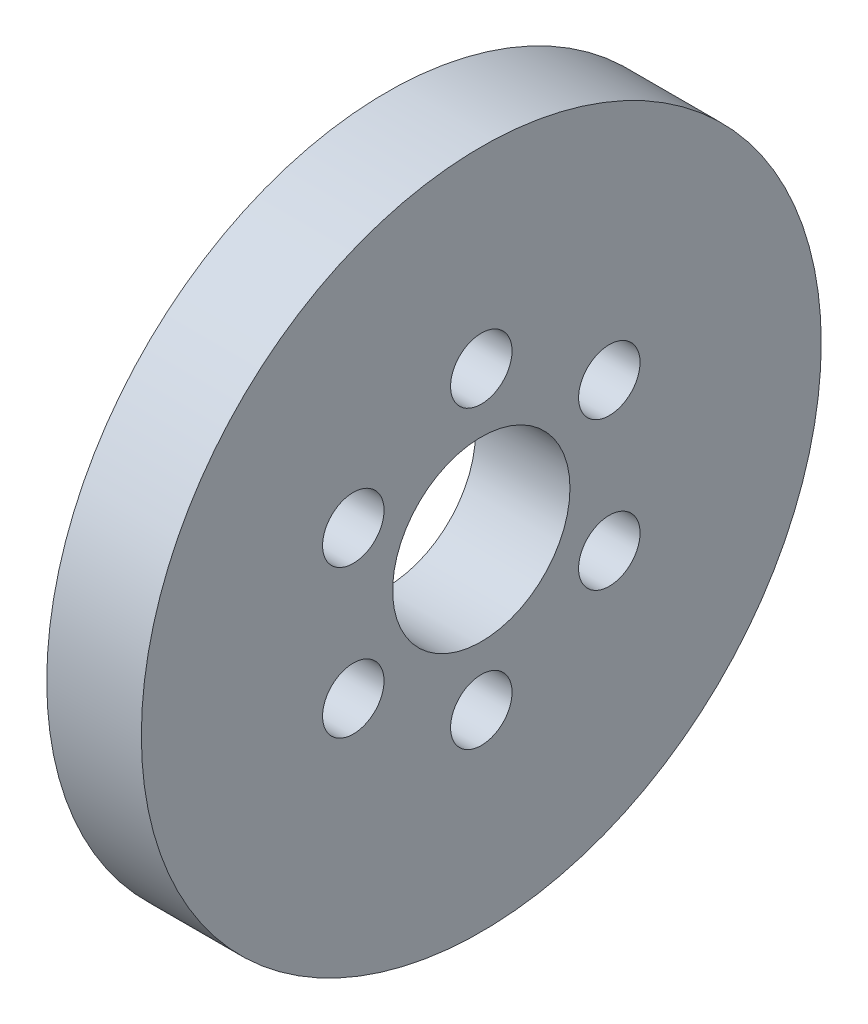
ISO-10303-21;
HEADER;
FILE_DESCRIPTION(('STEP AP214'),'2;1');
FILE_NAME('part.step','',(''),(''),'','','');
FILE_SCHEMA(('AUTOMOTIVE_DESIGN { 1 0 10303 214 1 1 1 1 }'));
ENDSEC;
DATA;
#1=APPLICATION_CONTEXT('core data for automotive mechanical design processes');
#2=APPLICATION_PROTOCOL_DEFINITION('international standard','automotive_design',2000,#1);
#3=PRODUCT_CONTEXT('',#1,'mechanical');
#4=PRODUCT('Part','Part','',(#3));
#5=PRODUCT_RELATED_PRODUCT_CATEGORY('part','',(#4));
#6=PRODUCT_DEFINITION_FORMATION('','',#4);
#7=PRODUCT_DEFINITION_CONTEXT('part definition',#1,'design');
#8=PRODUCT_DEFINITION('design','',#6,#7);
#9=PRODUCT_DEFINITION_SHAPE('','',#8);
#10=(LENGTH_UNIT() NAMED_UNIT(*) SI_UNIT(.MILLI.,.METRE.));
#11=(NAMED_UNIT(*) PLANE_ANGLE_UNIT() SI_UNIT($,.RADIAN.));
#12=(NAMED_UNIT(*) SI_UNIT($,.STERADIAN.) SOLID_ANGLE_UNIT());
#13=UNCERTAINTY_MEASURE_WITH_UNIT(LENGTH_MEASURE(1.E-05),#10,'distance_accuracy_value','');
#14=(GEOMETRIC_REPRESENTATION_CONTEXT(3) GLOBAL_UNCERTAINTY_ASSIGNED_CONTEXT((#13)) GLOBAL_UNIT_ASSIGNED_CONTEXT((#10,
#11,#12)) REPRESENTATION_CONTEXT('',''));
#15=CARTESIAN_POINT('',(0.,0.,0.));
#16=DIRECTION('',(0.,0.,1.));
#17=DIRECTION('',(1.,0.,0.));
#18=AXIS2_PLACEMENT_3D('',#15,#16,#17);
#19=CARTESIAN_POINT('',(5.08,0.,0.));
#20=DIRECTION('',(-1.,0.,0.));
#21=DIRECTION('',(0.,0.,1.));
#22=AXIS2_PLACEMENT_3D('',#19,#20,#21);
#23=CYLINDRICAL_SURFACE('',#22,18.25625);
#24=CARTESIAN_POINT('',(5.08,0.,0.));
#25=DIRECTION('',(1.,0.,0.));
#26=DIRECTION('',(0.,0.,-1.));
#27=AXIS2_PLACEMENT_3D('',#24,#25,#26);
#28=CIRCLE('',#27,18.25625);
#29=CARTESIAN_POINT('',(5.08,0.,-18.25625));
#30=VERTEX_POINT('',#29);
#31=EDGE_CURVE('E10',#30,#30,#28,.T.);
#32=ORIENTED_EDGE('',*,*,#31,.F.);
#33=EDGE_LOOP('',(#32));
#34=FACE_BOUND('',#33,.T.);
#35=CARTESIAN_POINT('',(0.,0.,0.));
#36=DIRECTION('',(1.,0.,0.));
#37=DIRECTION('',(0.,0.,-1.));
#38=AXIS2_PLACEMENT_3D('',#35,#36,#37);
#39=CIRCLE('',#38,18.25625);
#40=CARTESIAN_POINT('',(0.,0.,-18.25625));
#41=VERTEX_POINT('',#40);
#42=EDGE_CURVE('E40',#41,#41,#39,.T.);
#43=ORIENTED_EDGE('',*,*,#42,.T.);
#44=EDGE_LOOP('',(#43));
#45=FACE_BOUND('',#44,.T.);
#46=ADVANCED_FACE('F33',(#34,#45),#23,.T.);
#47=CARTESIAN_POINT('',(5.08,0.,0.));
#48=DIRECTION('',(1.,0.,0.));
#49=DIRECTION('',(0.,0.,-1.));
#50=AXIS2_PLACEMENT_3D('',#47,#48,#49);
#51=PLANE('',#50);
#52=CARTESIAN_POINT('',(5.08,0.,0.));
#53=DIRECTION('',(1.,0.,0.));
#54=DIRECTION('',(0.,0.,-1.));
#55=AXIS2_PLACEMENT_3D('',#52,#53,#54);
#56=CIRCLE('',#55,4.76249999999999);
#57=CARTESIAN_POINT('',(5.08,0.,-4.76249999999999));
#58=VERTEX_POINT('',#57);
#59=EDGE_CURVE('E82',#58,#58,#56,.T.);
#60=ORIENTED_EDGE('',*,*,#59,.F.);
#61=EDGE_LOOP('',(#60));
#62=FACE_BOUND('',#61,.T.);
#63=CARTESIAN_POINT('',(5.08,7.9375,0.));
#64=DIRECTION('',(1.,0.,0.));
#65=DIRECTION('',(0.,0.,-1.));
#66=AXIS2_PLACEMENT_3D('',#63,#64,#65);
#67=CIRCLE('',#66,1.65099999999999);
#68=CARTESIAN_POINT('',(5.08,7.9375,-1.65099999999999));
#69=VERTEX_POINT('',#68);
#70=EDGE_CURVE('E79',#69,#69,#67,.T.);
#71=ORIENTED_EDGE('',*,*,#70,.F.);
#72=EDGE_LOOP('',(#71));
#73=FACE_BOUND('',#72,.T.);
#74=CARTESIAN_POINT('',(5.08,3.96874999999998,-6.87407664253899));
#75=DIRECTION('',(1.,0.,0.));
#76=DIRECTION('',(0.,0.,-1.));
#77=AXIS2_PLACEMENT_3D('',#74,#75,#76);
#78=CIRCLE('',#77,1.65099999999999);
#79=CARTESIAN_POINT('',(5.08,3.96874999999998,-8.52507664253898));
#80=VERTEX_POINT('',#79);
#81=EDGE_CURVE('E73',#80,#80,#78,.T.);
#82=ORIENTED_EDGE('',*,*,#81,.F.);
#83=EDGE_LOOP('',(#82));
#84=FACE_BOUND('',#83,.T.);
#85=CARTESIAN_POINT('',(5.08,-3.96875000000003,-6.87407664253896));
#86=DIRECTION('',(1.,0.,0.));
#87=DIRECTION('',(0.,0.,-1.));
#88=AXIS2_PLACEMENT_3D('',#85,#86,#87);
#89=CIRCLE('',#88,1.65099999999999);
#90=CARTESIAN_POINT('',(5.08,-3.96875000000003,-8.52507664253895));
#91=VERTEX_POINT('',#90);
#92=EDGE_CURVE('E67',#91,#91,#89,.T.);
#93=ORIENTED_EDGE('',*,*,#92,.F.);
#94=EDGE_LOOP('',(#93));
#95=FACE_BOUND('',#94,.T.);
#96=CARTESIAN_POINT('',(5.08,-7.9375,0.));
#97=DIRECTION('',(1.,0.,0.));
#98=DIRECTION('',(0.,0.,-1.));
#99=AXIS2_PLACEMENT_3D('',#96,#97,#98);
#100=CIRCLE('',#99,1.65099999999999);
#101=CARTESIAN_POINT('',(5.08,-7.9375,-1.65099999999993));
#102=VERTEX_POINT('',#101);
#103=EDGE_CURVE('E61',#102,#102,#100,.T.);
#104=ORIENTED_EDGE('',*,*,#103,.F.);
#105=EDGE_LOOP('',(#104));
#106=FACE_BOUND('',#105,.T.);
#107=CARTESIAN_POINT('',(5.08,-3.96874999999994,6.87407664253902));
#108=DIRECTION('',(1.,0.,0.));
#109=DIRECTION('',(0.,0.,-1.));
#110=AXIS2_PLACEMENT_3D('',#107,#108,#109);
#111=CIRCLE('',#110,1.65099999999999);
#112=CARTESIAN_POINT('',(5.08,-3.96874999999994,5.22307664253903));
#113=VERTEX_POINT('',#112);
#114=EDGE_CURVE('E55',#113,#113,#111,.T.);
#115=ORIENTED_EDGE('',*,*,#114,.F.);
#116=EDGE_LOOP('',(#115));
#117=FACE_BOUND('',#116,.T.);
#118=CARTESIAN_POINT('',(5.08,3.96875000000008,6.87407664253894));
#119=DIRECTION('',(1.,0.,0.));
#120=DIRECTION('',(0.,0.,-1.));
#121=AXIS2_PLACEMENT_3D('',#118,#119,#120);
#122=CIRCLE('',#121,1.65099999999999);
#123=CARTESIAN_POINT('',(5.08,3.96875000000008,5.22307664253895));
#124=VERTEX_POINT('',#123);
#125=EDGE_CURVE('E49',#124,#124,#122,.T.);
#126=ORIENTED_EDGE('',*,*,#125,.F.);
#127=EDGE_LOOP('',(#126));
#128=FACE_BOUND('',#127,.T.);
#129=ORIENTED_EDGE('',*,*,#31,.T.);
#130=EDGE_LOOP('',(#129));
#131=FACE_BOUND('',#130,.T.);
#132=ADVANCED_FACE('F103',(#62,#73,#84,#95,#106,#117,#128,#131),#51,.T.);
#133=CARTESIAN_POINT('',(0.,0.,0.));
#134=DIRECTION('',(1.,0.,0.));
#135=DIRECTION('',(0.,0.,-1.));
#136=AXIS2_PLACEMENT_3D('',#133,#134,#135);
#137=PLANE('',#136);
#138=CARTESIAN_POINT('',(0.,0.,0.));
#139=DIRECTION('',(1.,0.,0.));
#140=DIRECTION('',(0.,0.,-1.));
#141=AXIS2_PLACEMENT_3D('',#138,#139,#140);
#142=CIRCLE('',#141,4.76249999999999);
#143=CARTESIAN_POINT('',(0.,0.,-4.76249999999999));
#144=VERTEX_POINT('',#143);
#145=EDGE_CURVE('E36',#144,#144,#142,.T.);
#146=ORIENTED_EDGE('',*,*,#145,.T.);
#147=EDGE_LOOP('',(#146));
#148=FACE_BOUND('',#147,.T.);
#149=CARTESIAN_POINT('',(0.,7.9375,0.));
#150=DIRECTION('',(1.,0.,0.));
#151=DIRECTION('',(0.,0.,-1.));
#152=AXIS2_PLACEMENT_3D('',#149,#150,#151);
#153=CIRCLE('',#152,1.65099999999999);
#154=CARTESIAN_POINT('',(0.,7.9375,-1.65099999999999));
#155=VERTEX_POINT('',#154);
#156=EDGE_CURVE('E76',#155,#155,#153,.T.);
#157=ORIENTED_EDGE('',*,*,#156,.T.);
#158=EDGE_LOOP('',(#157));
#159=FACE_BOUND('',#158,.T.);
#160=CARTESIAN_POINT('',(0.,3.96874999999998,-6.87407664253899));
#161=DIRECTION('',(1.,0.,0.));
#162=DIRECTION('',(0.,0.,-1.));
#163=AXIS2_PLACEMENT_3D('',#160,#161,#162);
#164=CIRCLE('',#163,1.65099999999999);
#165=CARTESIAN_POINT('',(0.,3.96874999999998,-8.52507664253898));
#166=VERTEX_POINT('',#165);
#167=EDGE_CURVE('E70',#166,#166,#164,.T.);
#168=ORIENTED_EDGE('',*,*,#167,.T.);
#169=EDGE_LOOP('',(#168));
#170=FACE_BOUND('',#169,.T.);
#171=CARTESIAN_POINT('',(0.,-3.96875000000003,-6.87407664253896));
#172=DIRECTION('',(1.,0.,0.));
#173=DIRECTION('',(0.,0.,-1.));
#174=AXIS2_PLACEMENT_3D('',#171,#172,#173);
#175=CIRCLE('',#174,1.65099999999999);
#176=CARTESIAN_POINT('',(0.,-3.96875000000003,-8.52507664253896));
#177=VERTEX_POINT('',#176);
#178=EDGE_CURVE('E64',#177,#177,#175,.T.);
#179=ORIENTED_EDGE('',*,*,#178,.T.);
#180=EDGE_LOOP('',(#179));
#181=FACE_BOUND('',#180,.T.);
#182=CARTESIAN_POINT('',(0.,-7.9375,0.));
#183=DIRECTION('',(1.,0.,0.));
#184=DIRECTION('',(0.,0.,-1.));
#185=AXIS2_PLACEMENT_3D('',#182,#183,#184);
#186=CIRCLE('',#185,1.65099999999999);
#187=CARTESIAN_POINT('',(0.,-7.9375,-1.65099999999994));
#188=VERTEX_POINT('',#187);
#189=EDGE_CURVE('E58',#188,#188,#186,.T.);
#190=ORIENTED_EDGE('',*,*,#189,.T.);
#191=EDGE_LOOP('',(#190));
#192=FACE_BOUND('',#191,.T.);
#193=CARTESIAN_POINT('',(0.,-3.96874999999994,6.87407664253902));
#194=DIRECTION('',(1.,0.,0.));
#195=DIRECTION('',(0.,0.,-1.));
#196=AXIS2_PLACEMENT_3D('',#193,#194,#195);
#197=CIRCLE('',#196,1.65099999999999);
#198=CARTESIAN_POINT('',(0.,-3.96874999999994,5.22307664253903));
#199=VERTEX_POINT('',#198);
#200=EDGE_CURVE('E52',#199,#199,#197,.T.);
#201=ORIENTED_EDGE('',*,*,#200,.T.);
#202=EDGE_LOOP('',(#201));
#203=FACE_BOUND('',#202,.T.);
#204=CARTESIAN_POINT('',(0.,3.96875000000008,6.87407664253894));
#205=DIRECTION('',(1.,0.,0.));
#206=DIRECTION('',(0.,0.,-1.));
#207=AXIS2_PLACEMENT_3D('',#204,#205,#206);
#208=CIRCLE('',#207,1.65099999999999);
#209=CARTESIAN_POINT('',(0.,3.96875000000008,5.22307664253894));
#210=VERTEX_POINT('',#209);
#211=EDGE_CURVE('E45',#210,#210,#208,.T.);
#212=ORIENTED_EDGE('',*,*,#211,.T.);
#213=EDGE_LOOP('',(#212));
#214=FACE_BOUND('',#213,.T.);
#215=ORIENTED_EDGE('',*,*,#42,.F.);
#216=EDGE_LOOP('',(#215));
#217=FACE_BOUND('',#216,.T.);
#218=ADVANCED_FACE('F89',(#148,#159,#170,#181,#192,#203,#214,#217),#137,.F.);
#219=CARTESIAN_POINT('',(5.08,3.96875000000008,6.87407664253894));
#220=DIRECTION('',(1.,0.,0.));
#221=DIRECTION('',(0.,0.,-1.));
#222=AXIS2_PLACEMENT_3D('',#219,#220,#221);
#223=CYLINDRICAL_SURFACE('',#222,1.65099999999999);
#224=ORIENTED_EDGE('',*,*,#211,.F.);
#225=EDGE_LOOP('',(#224));
#226=FACE_BOUND('',#225,.T.);
#227=ORIENTED_EDGE('',*,*,#125,.T.);
#228=EDGE_LOOP('',(#227));
#229=FACE_BOUND('',#228,.T.);
#230=ADVANCED_FACE('F114',(#226,#229),#223,.F.);
#231=CARTESIAN_POINT('',(5.08,-3.96874999999994,6.87407664253902));
#232=DIRECTION('',(1.,0.,0.));
#233=DIRECTION('',(0.,0.,-1.));
#234=AXIS2_PLACEMENT_3D('',#231,#232,#233);
#235=CYLINDRICAL_SURFACE('',#234,1.65099999999999);
#236=ORIENTED_EDGE('',*,*,#200,.F.);
#237=EDGE_LOOP('',(#236));
#238=FACE_BOUND('',#237,.T.);
#239=ORIENTED_EDGE('',*,*,#114,.T.);
#240=EDGE_LOOP('',(#239));
#241=FACE_BOUND('',#240,.T.);
#242=ADVANCED_FACE('F118',(#238,#241),#235,.F.);
#243=CARTESIAN_POINT('',(5.08,-7.9375,0.));
#244=DIRECTION('',(1.,0.,0.));
#245=DIRECTION('',(0.,0.,-1.));
#246=AXIS2_PLACEMENT_3D('',#243,#244,#245);
#247=CYLINDRICAL_SURFACE('',#246,1.65099999999999);
#248=ORIENTED_EDGE('',*,*,#189,.F.);
#249=EDGE_LOOP('',(#248));
#250=FACE_BOUND('',#249,.T.);
#251=ORIENTED_EDGE('',*,*,#103,.T.);
#252=EDGE_LOOP('',(#251));
#253=FACE_BOUND('',#252,.T.);
#254=ADVANCED_FACE('F124',(#250,#253),#247,.F.);
#255=CARTESIAN_POINT('',(5.08,-3.96875000000003,-6.87407664253896));
#256=DIRECTION('',(1.,0.,0.));
#257=DIRECTION('',(0.,0.,-1.));
#258=AXIS2_PLACEMENT_3D('',#255,#256,#257);
#259=CYLINDRICAL_SURFACE('',#258,1.65099999999999);
#260=ORIENTED_EDGE('',*,*,#178,.F.);
#261=EDGE_LOOP('',(#260));
#262=FACE_BOUND('',#261,.T.);
#263=ORIENTED_EDGE('',*,*,#92,.T.);
#264=EDGE_LOOP('',(#263));
#265=FACE_BOUND('',#264,.T.);
#266=ADVANCED_FACE('F128',(#262,#265),#259,.F.);
#267=CARTESIAN_POINT('',(5.08,3.96874999999998,-6.87407664253899));
#268=DIRECTION('',(1.,0.,0.));
#269=DIRECTION('',(0.,0.,-1.));
#270=AXIS2_PLACEMENT_3D('',#267,#268,#269);
#271=CYLINDRICAL_SURFACE('',#270,1.65099999999999);
#272=ORIENTED_EDGE('',*,*,#167,.F.);
#273=EDGE_LOOP('',(#272));
#274=FACE_BOUND('',#273,.T.);
#275=ORIENTED_EDGE('',*,*,#81,.T.);
#276=EDGE_LOOP('',(#275));
#277=FACE_BOUND('',#276,.T.);
#278=ADVANCED_FACE('F99',(#274,#277),#271,.F.);
#279=CARTESIAN_POINT('',(5.08,7.9375,0.));
#280=DIRECTION('',(1.,0.,0.));
#281=DIRECTION('',(0.,0.,-1.));
#282=AXIS2_PLACEMENT_3D('',#279,#280,#281);
#283=CYLINDRICAL_SURFACE('',#282,1.65099999999999);
#284=ORIENTED_EDGE('',*,*,#156,.F.);
#285=EDGE_LOOP('',(#284));
#286=FACE_BOUND('',#285,.T.);
#287=ORIENTED_EDGE('',*,*,#70,.T.);
#288=EDGE_LOOP('',(#287));
#289=FACE_BOUND('',#288,.T.);
#290=ADVANCED_FACE('F94',(#286,#289),#283,.F.);
#291=CARTESIAN_POINT('',(5.08,0.,0.));
#292=DIRECTION('',(1.,0.,0.));
#293=DIRECTION('',(0.,0.,-1.));
#294=AXIS2_PLACEMENT_3D('',#291,#292,#293);
#295=CYLINDRICAL_SURFACE('',#294,4.76249999999999);
#296=ORIENTED_EDGE('',*,*,#59,.T.);
#297=EDGE_LOOP('',(#296));
#298=FACE_BOUND('',#297,.T.);
#299=ORIENTED_EDGE('',*,*,#145,.F.);
#300=EDGE_LOOP('',(#299));
#301=FACE_BOUND('',#300,.T.);
#302=ADVANCED_FACE('F92',(#298,#301),#295,.F.);
#303=CLOSED_SHELL('',(#46,#132,#218,#230,#242,#254,#266,#278,#290,#302));
#304=MANIFOLD_SOLID_BREP('B2',#303);
#305=ADVANCED_BREP_SHAPE_REPRESENTATION('',(#18,#304),#14);
#306=SHAPE_DEFINITION_REPRESENTATION(#9,#305);
ENDSEC;
END-ISO-10303-21;
